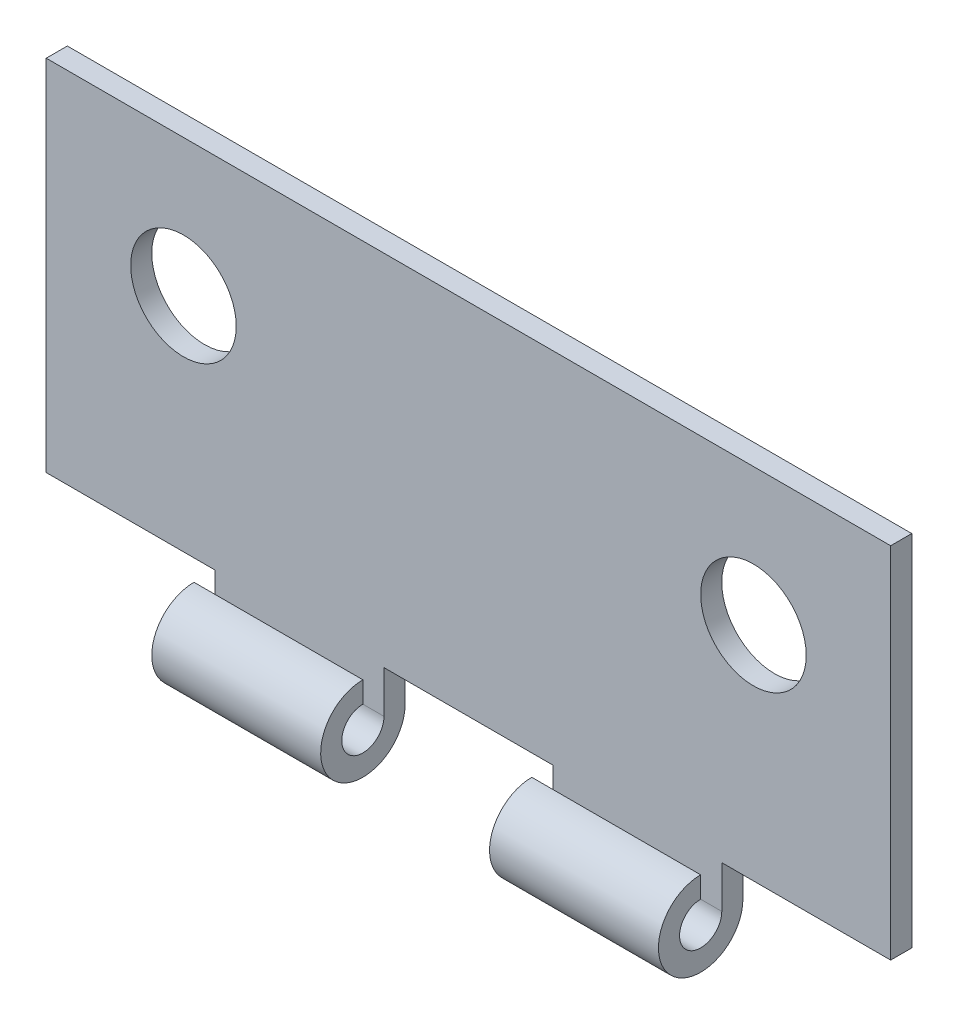
ISO-10303-21;
HEADER;
FILE_DESCRIPTION(('STEP AP214'),'2;1');
FILE_NAME('part.step','',(''),(''),'','','');
FILE_SCHEMA(('AUTOMOTIVE_DESIGN { 1 0 10303 214 1 1 1 1 }'));
ENDSEC;
DATA;
#1=APPLICATION_CONTEXT('core data for automotive mechanical design processes');
#2=APPLICATION_PROTOCOL_DEFINITION('international standard','automotive_design',2000,#1);
#3=PRODUCT_CONTEXT('',#1,'mechanical');
#4=PRODUCT('Part','Part','',(#3));
#5=PRODUCT_RELATED_PRODUCT_CATEGORY('part','',(#4));
#6=PRODUCT_DEFINITION_FORMATION('','',#4);
#7=PRODUCT_DEFINITION_CONTEXT('part definition',#1,'design');
#8=PRODUCT_DEFINITION('design','',#6,#7);
#9=PRODUCT_DEFINITION_SHAPE('','',#8);
#10=(LENGTH_UNIT() NAMED_UNIT(*) SI_UNIT(.MILLI.,.METRE.));
#11=(NAMED_UNIT(*) PLANE_ANGLE_UNIT() SI_UNIT($,.RADIAN.));
#12=(NAMED_UNIT(*) SI_UNIT($,.STERADIAN.) SOLID_ANGLE_UNIT());
#13=UNCERTAINTY_MEASURE_WITH_UNIT(LENGTH_MEASURE(1.E-05),#10,'distance_accuracy_value','');
#14=(GEOMETRIC_REPRESENTATION_CONTEXT(3) GLOBAL_UNCERTAINTY_ASSIGNED_CONTEXT((#13)) GLOBAL_UNIT_ASSIGNED_CONTEXT((#10,
#11,#12)) REPRESENTATION_CONTEXT('',''));
#15=CARTESIAN_POINT('',(0.,0.,0.));
#16=DIRECTION('',(0.,0.,1.));
#17=DIRECTION('',(1.,0.,0.));
#18=AXIS2_PLACEMENT_3D('',#15,#16,#17);
#19=CARTESIAN_POINT('',(0.,0.,1.));
#20=DIRECTION('',(0.,1.,0.));
#21=DIRECTION('',(0.,0.,1.));
#22=AXIS2_PLACEMENT_3D('',#19,#20,#21);
#23=PLANE('',#22);
#24=DIRECTION('',(0.,0.,-1.));
#25=VECTOR('',#24,1.);
#26=CARTESIAN_POINT('',(32.,0.,0.));
#27=LINE('',#26,#25);
#28=CARTESIAN_POINT('',(32.,0.,1.));
#29=VERTEX_POINT('',#28);
#30=CARTESIAN_POINT('',(32.,0.,0.));
#31=VERTEX_POINT('',#30);
#32=EDGE_CURVE('E180',#29,#31,#27,.T.);
#33=ORIENTED_EDGE('',*,*,#32,.T.);
#34=DIRECTION('',(1.,0.,0.));
#35=VECTOR('',#34,1.);
#36=CARTESIAN_POINT('',(0.,0.,0.));
#37=LINE('',#36,#35);
#38=CARTESIAN_POINT('',(40.,0.,0.));
#39=VERTEX_POINT('',#38);
#40=EDGE_CURVE('E266',#31,#39,#37,.T.);
#41=ORIENTED_EDGE('',*,*,#40,.T.);
#42=DIRECTION('',(0.,0.,-1.));
#43=VECTOR('',#42,1.);
#44=CARTESIAN_POINT('',(40.,0.,1.));
#45=LINE('',#44,#43);
#46=CARTESIAN_POINT('',(40.,0.,1.));
#47=VERTEX_POINT('',#46);
#48=EDGE_CURVE('E41',#47,#39,#45,.T.);
#49=ORIENTED_EDGE('',*,*,#48,.F.);
#50=DIRECTION('',(1.,0.,0.));
#51=VECTOR('',#50,1.);
#52=CARTESIAN_POINT('',(0.,0.,1.));
#53=LINE('',#52,#51);
#54=EDGE_CURVE('E48',#29,#47,#53,.T.);
#55=ORIENTED_EDGE('',*,*,#54,.F.);
#56=EDGE_LOOP('',(#33,#41,#49,#55));
#57=FACE_BOUND('',#56,.T.);
#58=ADVANCED_FACE('F33',(#57),#23,.F.);
#59=DIRECTION('',(0.,0.,-1.));
#60=VECTOR('',#59,1.);
#61=CARTESIAN_POINT('',(8.,0.,0.));
#62=LINE('',#61,#60);
#63=CARTESIAN_POINT('',(8.,0.,1.));
#64=VERTEX_POINT('',#63);
#65=CARTESIAN_POINT('',(8.,0.,0.));
#66=VERTEX_POINT('',#65);
#67=EDGE_CURVE('E193',#64,#66,#62,.T.);
#68=ORIENTED_EDGE('',*,*,#67,.F.);
#69=CARTESIAN_POINT('',(0.,0.,1.));
#70=VERTEX_POINT('',#69);
#71=EDGE_CURVE('E256',#70,#64,#53,.T.);
#72=ORIENTED_EDGE('',*,*,#71,.F.);
#73=DIRECTION('',(0.,0.,-1.));
#74=VECTOR('',#73,1.);
#75=CARTESIAN_POINT('',(0.,0.,1.));
#76=LINE('',#75,#74);
#77=CARTESIAN_POINT('',(0.,0.,0.));
#78=VERTEX_POINT('',#77);
#79=EDGE_CURVE('E11',#70,#78,#76,.T.);
#80=ORIENTED_EDGE('',*,*,#79,.T.);
#81=EDGE_CURVE('E267',#78,#66,#37,.T.);
#82=ORIENTED_EDGE('',*,*,#81,.T.);
#83=EDGE_LOOP('',(#68,#72,#80,#82));
#84=FACE_BOUND('',#83,.T.);
#85=ADVANCED_FACE('F322',(#84),#23,.F.);
#86=CARTESIAN_POINT('',(0.,0.,1.));
#87=DIRECTION('',(1.,0.,0.));
#88=DIRECTION('',(0.,0.,-1.));
#89=AXIS2_PLACEMENT_3D('',#86,#87,#88);
#90=PLANE('',#89);
#91=DIRECTION('',(0.,-1.,0.));
#92=VECTOR('',#91,1.);
#93=CARTESIAN_POINT('',(0.,0.,0.));
#94=LINE('',#93,#92);
#95=CARTESIAN_POINT('',(0.,17.,0.));
#96=VERTEX_POINT('',#95);
#97=EDGE_CURVE('E244',#96,#78,#94,.T.);
#98=ORIENTED_EDGE('',*,*,#97,.T.);
#99=ORIENTED_EDGE('',*,*,#79,.F.);
#100=DIRECTION('',(0.,-1.,0.));
#101=VECTOR('',#100,1.);
#102=CARTESIAN_POINT('',(0.,0.,1.));
#103=LINE('',#102,#101);
#104=CARTESIAN_POINT('',(0.,17.,1.));
#105=VERTEX_POINT('',#104);
#106=EDGE_CURVE('E253',#105,#70,#103,.T.);
#107=ORIENTED_EDGE('',*,*,#106,.F.);
#108=DIRECTION('',(0.,0.,-1.));
#109=VECTOR('',#108,1.);
#110=CARTESIAN_POINT('',(0.,17.,1.));
#111=LINE('',#110,#109);
#112=EDGE_CURVE('E263',#105,#96,#111,.T.);
#113=ORIENTED_EDGE('',*,*,#112,.T.);
#114=EDGE_LOOP('',(#98,#99,#107,#113));
#115=FACE_BOUND('',#114,.T.);
#116=ADVANCED_FACE('F35',(#115),#90,.F.);
#117=CARTESIAN_POINT('',(16.,0.,0.));
#118=VERTEX_POINT('',#117);
#119=CARTESIAN_POINT('',(24.,0.,0.));
#120=VERTEX_POINT('',#119);
#121=EDGE_CURVE('E270',#118,#120,#37,.T.);
#122=ORIENTED_EDGE('',*,*,#121,.T.);
#123=DIRECTION('',(0.,0.,-1.));
#124=VECTOR('',#123,1.);
#125=CARTESIAN_POINT('',(24.,0.,0.));
#126=LINE('',#125,#124);
#127=CARTESIAN_POINT('',(24.,0.,1.));
#128=VERTEX_POINT('',#127);
#129=EDGE_CURVE('E56',#128,#120,#126,.T.);
#130=ORIENTED_EDGE('',*,*,#129,.F.);
#131=CARTESIAN_POINT('',(16.,0.,1.));
#132=VERTEX_POINT('',#131);
#133=EDGE_CURVE('E171',#132,#128,#53,.T.);
#134=ORIENTED_EDGE('',*,*,#133,.F.);
#135=DIRECTION('',(0.,0.,-1.));
#136=VECTOR('',#135,1.);
#137=CARTESIAN_POINT('',(16.,0.,0.));
#138=LINE('',#137,#136);
#139=EDGE_CURVE('E198',#132,#118,#138,.T.);
#140=ORIENTED_EDGE('',*,*,#139,.T.);
#141=EDGE_LOOP('',(#122,#130,#134,#140));
#142=FACE_BOUND('',#141,.T.);
#143=ADVANCED_FACE('F301',(#142),#23,.F.);
#144=CARTESIAN_POINT('',(40.,0.,1.));
#145=DIRECTION('',(-1.,0.,0.));
#146=DIRECTION('',(0.,0.,1.));
#147=AXIS2_PLACEMENT_3D('',#144,#145,#146);
#148=PLANE('',#147);
#149=DIRECTION('',(0.,1.,0.));
#150=VECTOR('',#149,1.);
#151=CARTESIAN_POINT('',(40.,0.,0.));
#152=LINE('',#151,#150);
#153=CARTESIAN_POINT('',(40.,17.,0.));
#154=VERTEX_POINT('',#153);
#155=EDGE_CURVE('E269',#39,#154,#152,.T.);
#156=ORIENTED_EDGE('',*,*,#155,.T.);
#157=DIRECTION('',(0.,0.,-1.));
#158=VECTOR('',#157,1.);
#159=CARTESIAN_POINT('',(40.,17.,1.));
#160=LINE('',#159,#158);
#161=CARTESIAN_POINT('',(40.,17.,1.));
#162=VERTEX_POINT('',#161);
#163=EDGE_CURVE('E275',#162,#154,#160,.T.);
#164=ORIENTED_EDGE('',*,*,#163,.F.);
#165=DIRECTION('',(0.,1.,0.));
#166=VECTOR('',#165,1.);
#167=CARTESIAN_POINT('',(40.,0.,1.));
#168=LINE('',#167,#166);
#169=EDGE_CURVE('E259',#47,#162,#168,.T.);
#170=ORIENTED_EDGE('',*,*,#169,.F.);
#171=ORIENTED_EDGE('',*,*,#48,.T.);
#172=EDGE_LOOP('',(#156,#164,#170,#171));
#173=FACE_BOUND('',#172,.T.);
#174=ADVANCED_FACE('F281',(#173),#148,.F.);
#175=CARTESIAN_POINT('',(0.,17.,1.));
#176=DIRECTION('',(0.,-1.,0.));
#177=DIRECTION('',(0.,0.,-1.));
#178=AXIS2_PLACEMENT_3D('',#175,#176,#177);
#179=PLANE('',#178);
#180=DIRECTION('',(-1.,0.,0.));
#181=VECTOR('',#180,1.);
#182=CARTESIAN_POINT('',(0.,17.,0.));
#183=LINE('',#182,#181);
#184=EDGE_CURVE('E255',#154,#96,#183,.T.);
#185=ORIENTED_EDGE('',*,*,#184,.T.);
#186=ORIENTED_EDGE('',*,*,#112,.F.);
#187=DIRECTION('',(-1.,0.,0.));
#188=VECTOR('',#187,1.);
#189=CARTESIAN_POINT('',(0.,17.,1.));
#190=LINE('',#189,#188);
#191=EDGE_CURVE('E261',#162,#105,#190,.T.);
#192=ORIENTED_EDGE('',*,*,#191,.F.);
#193=ORIENTED_EDGE('',*,*,#163,.T.);
#194=EDGE_LOOP('',(#185,#186,#192,#193));
#195=FACE_BOUND('',#194,.T.);
#196=ADVANCED_FACE('F289',(#195),#179,.F.);
#197=CARTESIAN_POINT('',(0.,0.,1.));
#198=DIRECTION('',(0.,0.,-1.));
#199=DIRECTION('',(-1.,0.,0.));
#200=AXIS2_PLACEMENT_3D('',#197,#198,#199);
#201=PLANE('',#200);
#202=CARTESIAN_POINT('',(6.5,10.5,1.));
#203=DIRECTION('',(0.,0.,1.));
#204=DIRECTION('',(1.,0.,0.));
#205=AXIS2_PLACEMENT_3D('',#202,#203,#204);
#206=CIRCLE('',#205,2.5);
#207=CARTESIAN_POINT('',(9.,10.5,1.));
#208=VERTEX_POINT('',#207);
#209=EDGE_CURVE('E241',#208,#208,#206,.T.);
#210=ORIENTED_EDGE('',*,*,#209,.F.);
#211=EDGE_LOOP('',(#210));
#212=FACE_BOUND('',#211,.T.);
#213=CARTESIAN_POINT('',(33.5,10.5,1.));
#214=DIRECTION('',(0.,0.,1.));
#215=DIRECTION('',(1.,0.,0.));
#216=AXIS2_PLACEMENT_3D('',#213,#214,#215);
#217=CIRCLE('',#216,2.5);
#218=CARTESIAN_POINT('',(36.,10.5,1.));
#219=VERTEX_POINT('',#218);
#220=EDGE_CURVE('E248',#219,#219,#217,.T.);
#221=ORIENTED_EDGE('',*,*,#220,.F.);
#222=EDGE_LOOP('',(#221));
#223=FACE_BOUND('',#222,.T.);
#224=ORIENTED_EDGE('',*,*,#106,.T.);
#225=ORIENTED_EDGE('',*,*,#71,.T.);
#226=DIRECTION('',(0.,1.,0.));
#227=VECTOR('',#226,1.);
#228=CARTESIAN_POINT('',(8.,-2.,1.));
#229=LINE('',#228,#227);
#230=CARTESIAN_POINT('',(8.,-2.,1.));
#231=VERTEX_POINT('',#230);
#232=EDGE_CURVE('E202',#231,#64,#229,.T.);
#233=ORIENTED_EDGE('',*,*,#232,.F.);
#234=DIRECTION('',(-1.,0.,0.));
#235=VECTOR('',#234,1.);
#236=CARTESIAN_POINT('',(16.,-2.,1.));
#237=LINE('',#236,#235);
#238=CARTESIAN_POINT('',(16.,-2.,1.));
#239=VERTEX_POINT('',#238);
#240=EDGE_CURVE('E233',#239,#231,#237,.T.);
#241=ORIENTED_EDGE('',*,*,#240,.F.);
#242=DIRECTION('',(0.,1.,0.));
#243=VECTOR('',#242,1.);
#244=CARTESIAN_POINT('',(16.,-2.,1.));
#245=LINE('',#244,#243);
#246=EDGE_CURVE('E214',#239,#132,#245,.T.);
#247=ORIENTED_EDGE('',*,*,#246,.T.);
#248=ORIENTED_EDGE('',*,*,#133,.T.);
#249=DIRECTION('',(0.,1.,0.));
#250=VECTOR('',#249,1.);
#251=CARTESIAN_POINT('',(24.,-2.,1.));
#252=LINE('',#251,#250);
#253=CARTESIAN_POINT('',(24.,-2.,1.));
#254=VERTEX_POINT('',#253);
#255=EDGE_CURVE('E151',#254,#128,#252,.T.);
#256=ORIENTED_EDGE('',*,*,#255,.F.);
#257=DIRECTION('',(1.,0.,0.));
#258=VECTOR('',#257,1.);
#259=CARTESIAN_POINT('',(24.,-2.,1.));
#260=LINE('',#259,#258);
#261=CARTESIAN_POINT('',(32.,-2.,1.));
#262=VERTEX_POINT('',#261);
#263=EDGE_CURVE('E159',#254,#262,#260,.T.);
#264=ORIENTED_EDGE('',*,*,#263,.T.);
#265=DIRECTION('',(0.,1.,0.));
#266=VECTOR('',#265,1.);
#267=CARTESIAN_POINT('',(32.,-2.,1.));
#268=LINE('',#267,#266);
#269=EDGE_CURVE('E182',#262,#29,#268,.T.);
#270=ORIENTED_EDGE('',*,*,#269,.T.);
#271=ORIENTED_EDGE('',*,*,#54,.T.);
#272=ORIENTED_EDGE('',*,*,#169,.T.);
#273=ORIENTED_EDGE('',*,*,#191,.T.);
#274=EDGE_LOOP('',(#224,#225,#233,#241,#247,#248,#256,#264,#270,#271,#272,#273));
#275=FACE_BOUND('',#274,.T.);
#276=ADVANCED_FACE('F169',(#212,#223,#275),#201,.F.);
#277=CARTESIAN_POINT('',(0.,0.,0.));
#278=DIRECTION('',(0.,0.,-1.));
#279=DIRECTION('',(-1.,0.,0.));
#280=AXIS2_PLACEMENT_3D('',#277,#278,#279);
#281=PLANE('',#280);
#282=CARTESIAN_POINT('',(6.5,10.5,0.));
#283=DIRECTION('',(0.,0.,-1.));
#284=DIRECTION('',(-1.,0.,0.));
#285=AXIS2_PLACEMENT_3D('',#282,#283,#284);
#286=CIRCLE('',#285,2.5);
#287=CARTESIAN_POINT('',(4.,10.5,0.));
#288=VERTEX_POINT('',#287);
#289=EDGE_CURVE('E245',#288,#288,#286,.F.);
#290=ORIENTED_EDGE('',*,*,#289,.T.);
#291=EDGE_LOOP('',(#290));
#292=FACE_BOUND('',#291,.T.);
#293=CARTESIAN_POINT('',(33.5,10.5,0.));
#294=DIRECTION('',(0.,0.,-1.));
#295=DIRECTION('',(-1.,0.,0.));
#296=AXIS2_PLACEMENT_3D('',#293,#294,#295);
#297=CIRCLE('',#296,2.5);
#298=CARTESIAN_POINT('',(31.,10.5,0.));
#299=VERTEX_POINT('',#298);
#300=EDGE_CURVE('E235',#299,#299,#297,.F.);
#301=ORIENTED_EDGE('',*,*,#300,.T.);
#302=EDGE_LOOP('',(#301));
#303=FACE_BOUND('',#302,.T.);
#304=ORIENTED_EDGE('',*,*,#97,.F.);
#305=ORIENTED_EDGE('',*,*,#184,.F.);
#306=ORIENTED_EDGE('',*,*,#155,.F.);
#307=ORIENTED_EDGE('',*,*,#40,.F.);
#308=DIRECTION('',(0.,-1.,0.));
#309=VECTOR('',#308,1.);
#310=CARTESIAN_POINT('',(32.,0.,0.));
#311=LINE('',#310,#309);
#312=CARTESIAN_POINT('',(32.,-2.,0.));
#313=VERTEX_POINT('',#312);
#314=EDGE_CURVE('E173',#31,#313,#311,.T.);
#315=ORIENTED_EDGE('',*,*,#314,.T.);
#316=DIRECTION('',(1.,0.,0.));
#317=VECTOR('',#316,1.);
#318=CARTESIAN_POINT('',(24.,-2.,0.));
#319=LINE('',#318,#317);
#320=CARTESIAN_POINT('',(24.,-2.,0.));
#321=VERTEX_POINT('',#320);
#322=EDGE_CURVE('E190',#321,#313,#319,.T.);
#323=ORIENTED_EDGE('',*,*,#322,.F.);
#324=DIRECTION('',(0.,-1.,0.));
#325=VECTOR('',#324,1.);
#326=CARTESIAN_POINT('',(24.,0.,0.));
#327=LINE('',#326,#325);
#328=EDGE_CURVE('E166',#120,#321,#327,.T.);
#329=ORIENTED_EDGE('',*,*,#328,.F.);
#330=ORIENTED_EDGE('',*,*,#121,.F.);
#331=DIRECTION('',(0.,-1.,0.));
#332=VECTOR('',#331,1.);
#333=CARTESIAN_POINT('',(16.,0.,0.));
#334=LINE('',#333,#332);
#335=CARTESIAN_POINT('',(16.,-2.,0.));
#336=VERTEX_POINT('',#335);
#337=EDGE_CURVE('E201',#118,#336,#334,.T.);
#338=ORIENTED_EDGE('',*,*,#337,.T.);
#339=DIRECTION('',(-1.,0.,0.));
#340=VECTOR('',#339,1.);
#341=CARTESIAN_POINT('',(16.,-2.,0.));
#342=LINE('',#341,#340);
#343=CARTESIAN_POINT('',(8.,-2.,0.));
#344=VERTEX_POINT('',#343);
#345=EDGE_CURVE('E216',#336,#344,#342,.T.);
#346=ORIENTED_EDGE('',*,*,#345,.T.);
#347=DIRECTION('',(0.,-1.,0.));
#348=VECTOR('',#347,1.);
#349=CARTESIAN_POINT('',(8.,0.,0.));
#350=LINE('',#349,#348);
#351=EDGE_CURVE('E219',#66,#344,#350,.T.);
#352=ORIENTED_EDGE('',*,*,#351,.F.);
#353=ORIENTED_EDGE('',*,*,#81,.F.);
#354=EDGE_LOOP('',(#304,#305,#306,#307,#315,#323,#329,#330,#338,#346,#352,#353));
#355=FACE_BOUND('',#354,.T.);
#356=ADVANCED_FACE('F286',(#292,#303,#355),#281,.T.);
#357=CARTESIAN_POINT('',(33.5,10.5,-0.000999999999999916));
#358=DIRECTION('',(0.,0.,1.));
#359=DIRECTION('',(1.,0.,0.));
#360=AXIS2_PLACEMENT_3D('',#357,#358,#359);
#361=CYLINDRICAL_SURFACE('',#360,2.5);
#362=ORIENTED_EDGE('',*,*,#300,.F.);
#363=EDGE_LOOP('',(#362));
#364=FACE_BOUND('',#363,.T.);
#365=ORIENTED_EDGE('',*,*,#220,.T.);
#366=EDGE_LOOP('',(#365));
#367=FACE_BOUND('',#366,.T.);
#368=ADVANCED_FACE('F425',(#364,#367),#361,.F.);
#369=CARTESIAN_POINT('',(6.5,10.5,-0.000999999999999916));
#370=DIRECTION('',(0.,0.,1.));
#371=DIRECTION('',(1.,0.,0.));
#372=AXIS2_PLACEMENT_3D('',#369,#370,#371);
#373=CYLINDRICAL_SURFACE('',#372,2.5);
#374=ORIENTED_EDGE('',*,*,#289,.F.);
#375=EDGE_LOOP('',(#374));
#376=FACE_BOUND('',#375,.T.);
#377=ORIENTED_EDGE('',*,*,#209,.T.);
#378=EDGE_LOOP('',(#377));
#379=FACE_BOUND('',#378,.T.);
#380=ADVANCED_FACE('F348',(#376,#379),#373,.F.);
#381=CARTESIAN_POINT('',(16.,-2.,2.));
#382=DIRECTION('',(-1.,0.,0.));
#383=DIRECTION('',(0.,0.,1.));
#384=AXIS2_PLACEMENT_3D('',#381,#382,#383);
#385=CYLINDRICAL_SURFACE('',#384,1.);
#386=CARTESIAN_POINT('',(8.,-2.,2.));
#387=DIRECTION('',(1.,0.,0.));
#388=DIRECTION('',(0.,0.,-1.));
#389=AXIS2_PLACEMENT_3D('',#386,#387,#388);
#390=CIRCLE('',#389,1.);
#391=CARTESIAN_POINT('',(8.,-1.,2.));
#392=VERTEX_POINT('',#391);
#393=EDGE_CURVE('E228',#392,#231,#390,.T.);
#394=ORIENTED_EDGE('',*,*,#393,.F.);
#395=DIRECTION('',(-1.,0.,0.));
#396=VECTOR('',#395,1.);
#397=CARTESIAN_POINT('',(16.,-1.,2.));
#398=LINE('',#397,#396);
#399=CARTESIAN_POINT('',(16.,-1.,2.));
#400=VERTEX_POINT('',#399);
#401=EDGE_CURVE('E236',#400,#392,#398,.T.);
#402=ORIENTED_EDGE('',*,*,#401,.F.);
#403=CARTESIAN_POINT('',(16.,-2.,2.));
#404=DIRECTION('',(1.,0.,0.));
#405=DIRECTION('',(0.,0.,-1.));
#406=AXIS2_PLACEMENT_3D('',#403,#404,#405);
#407=CIRCLE('',#406,1.);
#408=EDGE_CURVE('E211',#400,#239,#407,.T.);
#409=ORIENTED_EDGE('',*,*,#408,.T.);
#410=ORIENTED_EDGE('',*,*,#240,.T.);
#411=EDGE_LOOP('',(#394,#402,#409,#410));
#412=FACE_BOUND('',#411,.T.);
#413=ADVANCED_FACE('F352',(#412),#385,.F.);
#414=CARTESIAN_POINT('',(16.,0.,2.));
#415=DIRECTION('',(0.,0.,-1.));
#416=DIRECTION('',(0.,1.,0.));
#417=AXIS2_PLACEMENT_3D('',#414,#415,#416);
#418=PLANE('',#417);
#419=DIRECTION('',(0.,-1.,0.));
#420=VECTOR('',#419,1.);
#421=CARTESIAN_POINT('',(8.,0.,2.));
#422=LINE('',#421,#420);
#423=CARTESIAN_POINT('',(8.,0.,2.));
#424=VERTEX_POINT('',#423);
#425=EDGE_CURVE('E225',#424,#392,#422,.T.);
#426=ORIENTED_EDGE('',*,*,#425,.F.);
#427=DIRECTION('',(-1.,0.,0.));
#428=VECTOR('',#427,1.);
#429=CARTESIAN_POINT('',(16.,0.,2.));
#430=LINE('',#429,#428);
#431=CARTESIAN_POINT('',(16.,0.,2.));
#432=VERTEX_POINT('',#431);
#433=EDGE_CURVE('E238',#432,#424,#430,.T.);
#434=ORIENTED_EDGE('',*,*,#433,.F.);
#435=DIRECTION('',(0.,-1.,0.));
#436=VECTOR('',#435,1.);
#437=CARTESIAN_POINT('',(16.,0.,2.));
#438=LINE('',#437,#436);
#439=EDGE_CURVE('E208',#432,#400,#438,.T.);
#440=ORIENTED_EDGE('',*,*,#439,.T.);
#441=ORIENTED_EDGE('',*,*,#401,.T.);
#442=EDGE_LOOP('',(#426,#434,#440,#441));
#443=FACE_BOUND('',#442,.T.);
#444=ADVANCED_FACE('F357',(#443),#418,.T.);
#445=CARTESIAN_POINT('',(16.,-2.,2.));
#446=DIRECTION('',(-1.,0.,0.));
#447=DIRECTION('',(0.,0.,1.));
#448=AXIS2_PLACEMENT_3D('',#445,#446,#447);
#449=CYLINDRICAL_SURFACE('',#448,2.);
#450=CARTESIAN_POINT('',(8.,-2.,2.));
#451=DIRECTION('',(-1.,0.,0.));
#452=DIRECTION('',(0.,0.,1.));
#453=AXIS2_PLACEMENT_3D('',#450,#451,#452);
#454=CIRCLE('',#453,2.);
#455=EDGE_CURVE('E222',#344,#424,#454,.T.);
#456=ORIENTED_EDGE('',*,*,#455,.F.);
#457=ORIENTED_EDGE('',*,*,#345,.F.);
#458=CARTESIAN_POINT('',(16.,-2.,2.));
#459=DIRECTION('',(-1.,0.,0.));
#460=DIRECTION('',(0.,0.,1.));
#461=AXIS2_PLACEMENT_3D('',#458,#459,#460);
#462=CIRCLE('',#461,2.);
#463=EDGE_CURVE('E205',#336,#432,#462,.T.);
#464=ORIENTED_EDGE('',*,*,#463,.T.);
#465=ORIENTED_EDGE('',*,*,#433,.T.);
#466=EDGE_LOOP('',(#456,#457,#464,#465));
#467=FACE_BOUND('',#466,.T.);
#468=ADVANCED_FACE('F368',(#467),#449,.T.);
#469=CARTESIAN_POINT('',(16.,-2.,2.));
#470=DIRECTION('',(1.,0.,0.));
#471=DIRECTION('',(0.,0.,-1.));
#472=AXIS2_PLACEMENT_3D('',#469,#470,#471);
#473=PLANE('',#472);
#474=ORIENTED_EDGE('',*,*,#139,.F.);
#475=ORIENTED_EDGE('',*,*,#246,.F.);
#476=ORIENTED_EDGE('',*,*,#408,.F.);
#477=ORIENTED_EDGE('',*,*,#439,.F.);
#478=ORIENTED_EDGE('',*,*,#463,.F.);
#479=ORIENTED_EDGE('',*,*,#337,.F.);
#480=EDGE_LOOP('',(#474,#475,#476,#477,#478,#479));
#481=FACE_BOUND('',#480,.T.);
#482=ADVANCED_FACE('F378',(#481),#473,.T.);
#483=CARTESIAN_POINT('',(8.,-2.,2.));
#484=DIRECTION('',(1.,0.,0.));
#485=DIRECTION('',(0.,0.,-1.));
#486=AXIS2_PLACEMENT_3D('',#483,#484,#485);
#487=PLANE('',#486);
#488=ORIENTED_EDGE('',*,*,#67,.T.);
#489=ORIENTED_EDGE('',*,*,#351,.T.);
#490=ORIENTED_EDGE('',*,*,#455,.T.);
#491=ORIENTED_EDGE('',*,*,#425,.T.);
#492=ORIENTED_EDGE('',*,*,#393,.T.);
#493=ORIENTED_EDGE('',*,*,#232,.T.);
#494=EDGE_LOOP('',(#488,#489,#490,#491,#492,#493));
#495=FACE_BOUND('',#494,.T.);
#496=ADVANCED_FACE('F319',(#495),#487,.F.);
#497=CARTESIAN_POINT('',(24.,-2.,2.));
#498=DIRECTION('',(1.,0.,0.));
#499=DIRECTION('',(0.,0.,-1.));
#500=AXIS2_PLACEMENT_3D('',#497,#498,#499);
#501=CYLINDRICAL_SURFACE('',#500,2.);
#502=CARTESIAN_POINT('',(32.,-2.,2.));
#503=DIRECTION('',(-1.,0.,0.));
#504=DIRECTION('',(0.,0.,1.));
#505=AXIS2_PLACEMENT_3D('',#502,#503,#504);
#506=CIRCLE('',#505,2.);
#507=CARTESIAN_POINT('',(32.,0.,2.));
#508=VERTEX_POINT('',#507);
#509=EDGE_CURVE('E187',#313,#508,#506,.T.);
#510=ORIENTED_EDGE('',*,*,#509,.T.);
#511=DIRECTION('',(1.,0.,0.));
#512=VECTOR('',#511,1.);
#513=CARTESIAN_POINT('',(24.,0.,2.));
#514=LINE('',#513,#512);
#515=CARTESIAN_POINT('',(24.,0.,2.));
#516=VERTEX_POINT('',#515);
#517=EDGE_CURVE('E194',#516,#508,#514,.T.);
#518=ORIENTED_EDGE('',*,*,#517,.F.);
#519=CARTESIAN_POINT('',(24.,-2.,2.));
#520=DIRECTION('',(-1.,0.,0.));
#521=DIRECTION('',(0.,0.,1.));
#522=AXIS2_PLACEMENT_3D('',#519,#520,#521);
#523=CIRCLE('',#522,2.);
#524=EDGE_CURVE('E177',#321,#516,#523,.T.);
#525=ORIENTED_EDGE('',*,*,#524,.F.);
#526=ORIENTED_EDGE('',*,*,#322,.T.);
#527=EDGE_LOOP('',(#510,#518,#525,#526));
#528=FACE_BOUND('',#527,.T.);
#529=ADVANCED_FACE('F308',(#528),#501,.T.);
#530=CARTESIAN_POINT('',(24.,0.,2.));
#531=DIRECTION('',(0.,0.,1.));
#532=DIRECTION('',(0.,-1.,0.));
#533=AXIS2_PLACEMENT_3D('',#530,#531,#532);
#534=PLANE('',#533);
#535=DIRECTION('',(0.,-1.,0.));
#536=VECTOR('',#535,1.);
#537=CARTESIAN_POINT('',(32.,0.,2.));
#538=LINE('',#537,#536);
#539=CARTESIAN_POINT('',(32.,-1.,2.));
#540=VERTEX_POINT('',#539);
#541=EDGE_CURVE('E185',#508,#540,#538,.T.);
#542=ORIENTED_EDGE('',*,*,#541,.T.);
#543=DIRECTION('',(1.,0.,0.));
#544=VECTOR('',#543,1.);
#545=CARTESIAN_POINT('',(24.,-1.,2.));
#546=LINE('',#545,#544);
#547=CARTESIAN_POINT('',(24.,-1.,2.));
#548=VERTEX_POINT('',#547);
#549=EDGE_CURVE('E165',#548,#540,#546,.T.);
#550=ORIENTED_EDGE('',*,*,#549,.F.);
#551=DIRECTION('',(0.,-1.,0.));
#552=VECTOR('',#551,1.);
#553=CARTESIAN_POINT('',(24.,0.,2.));
#554=LINE('',#553,#552);
#555=EDGE_CURVE('E153',#516,#548,#554,.T.);
#556=ORIENTED_EDGE('',*,*,#555,.F.);
#557=ORIENTED_EDGE('',*,*,#517,.T.);
#558=EDGE_LOOP('',(#542,#550,#556,#557));
#559=FACE_BOUND('',#558,.T.);
#560=ADVANCED_FACE('F311',(#559),#534,.F.);
#561=CARTESIAN_POINT('',(24.,-2.,2.));
#562=DIRECTION('',(1.,0.,0.));
#563=DIRECTION('',(0.,0.,-1.));
#564=AXIS2_PLACEMENT_3D('',#561,#562,#563);
#565=CYLINDRICAL_SURFACE('',#564,1.);
#566=CARTESIAN_POINT('',(32.,-2.,2.));
#567=DIRECTION('',(1.,0.,0.));
#568=DIRECTION('',(0.,0.,-1.));
#569=AXIS2_PLACEMENT_3D('',#566,#567,#568);
#570=CIRCLE('',#569,1.);
#571=EDGE_CURVE('E162',#540,#262,#570,.T.);
#572=ORIENTED_EDGE('',*,*,#571,.T.);
#573=ORIENTED_EDGE('',*,*,#263,.F.);
#574=CARTESIAN_POINT('',(24.,-2.,2.));
#575=DIRECTION('',(1.,0.,0.));
#576=DIRECTION('',(0.,0.,-1.));
#577=AXIS2_PLACEMENT_3D('',#574,#575,#576);
#578=CIRCLE('',#577,1.);
#579=EDGE_CURVE('E147',#548,#254,#578,.T.);
#580=ORIENTED_EDGE('',*,*,#579,.F.);
#581=ORIENTED_EDGE('',*,*,#549,.T.);
#582=EDGE_LOOP('',(#572,#573,#580,#581));
#583=FACE_BOUND('',#582,.T.);
#584=ADVANCED_FACE('F160',(#583),#565,.F.);
#585=CARTESIAN_POINT('',(24.,-2.,2.));
#586=DIRECTION('',(-1.,0.,0.));
#587=DIRECTION('',(0.,0.,-1.));
#588=AXIS2_PLACEMENT_3D('',#585,#586,#587);
#589=PLANE('',#588);
#590=ORIENTED_EDGE('',*,*,#129,.T.);
#591=ORIENTED_EDGE('',*,*,#328,.T.);
#592=ORIENTED_EDGE('',*,*,#524,.T.);
#593=ORIENTED_EDGE('',*,*,#555,.T.);
#594=ORIENTED_EDGE('',*,*,#579,.T.);
#595=ORIENTED_EDGE('',*,*,#255,.T.);
#596=EDGE_LOOP('',(#590,#591,#592,#593,#594,#595));
#597=FACE_BOUND('',#596,.T.);
#598=ADVANCED_FACE('F149',(#597),#589,.T.);
#599=CARTESIAN_POINT('',(32.,-2.,2.));
#600=DIRECTION('',(-1.,0.,0.));
#601=DIRECTION('',(0.,0.,-1.));
#602=AXIS2_PLACEMENT_3D('',#599,#600,#601);
#603=PLANE('',#602);
#604=ORIENTED_EDGE('',*,*,#32,.F.);
#605=ORIENTED_EDGE('',*,*,#269,.F.);
#606=ORIENTED_EDGE('',*,*,#571,.F.);
#607=ORIENTED_EDGE('',*,*,#541,.F.);
#608=ORIENTED_EDGE('',*,*,#509,.F.);
#609=ORIENTED_EDGE('',*,*,#314,.F.);
#610=EDGE_LOOP('',(#604,#605,#606,#607,#608,#609));
#611=FACE_BOUND('',#610,.T.);
#612=ADVANCED_FACE('F298',(#611),#603,.F.);
#613=CLOSED_SHELL('',(#58,#85,#116,#143,#174,#196,#276,#356,#368,#380,#413,#444,#468,#482,#496,
#529,#560,#584,#598,#612));
#614=MANIFOLD_SOLID_BREP('B2',#613);
#615=ADVANCED_BREP_SHAPE_REPRESENTATION('',(#18,#614),#14);
#616=SHAPE_DEFINITION_REPRESENTATION(#9,#615);
ENDSEC;
END-ISO-10303-21;
